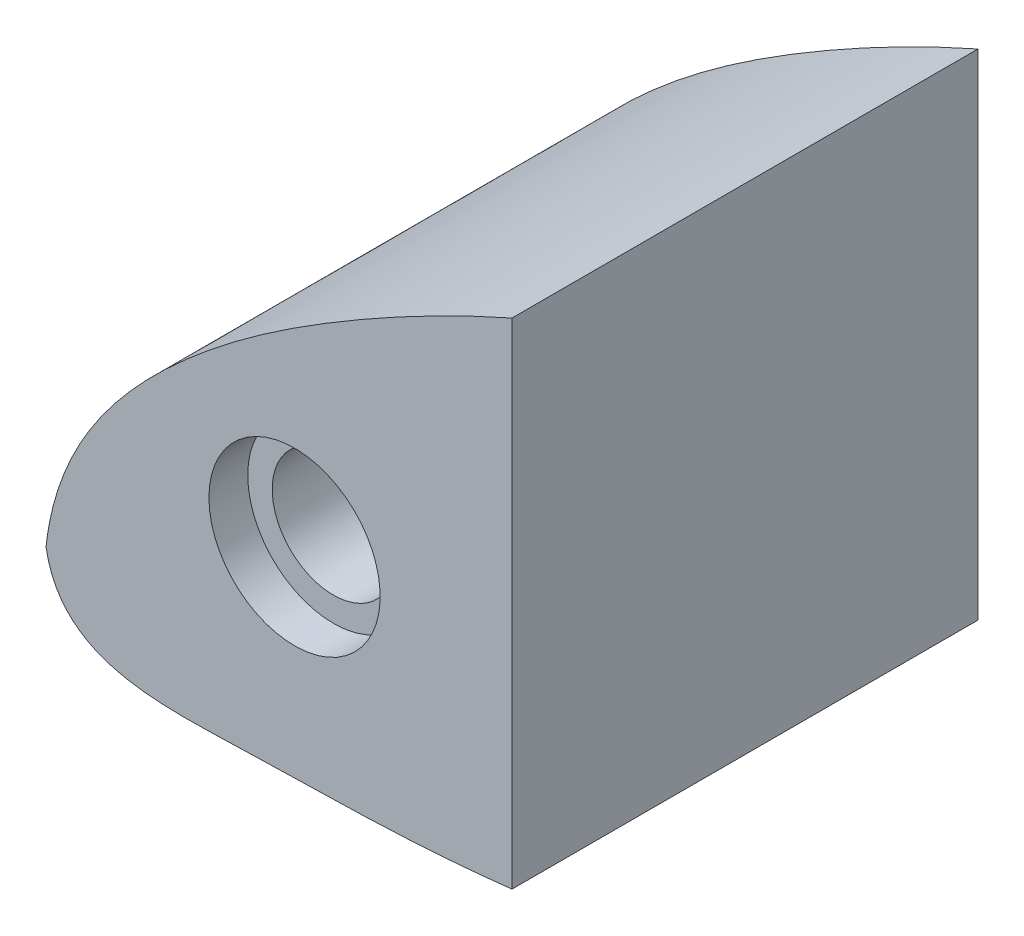
ISO-10303-21;
HEADER;
FILE_DESCRIPTION(('STEP AP214'),'2;1');
FILE_NAME('part.step','',(''),(''),'','','');
FILE_SCHEMA(('AUTOMOTIVE_DESIGN { 1 0 10303 214 1 1 1 1 }'));
ENDSEC;
DATA;
#1=APPLICATION_CONTEXT('core data for automotive mechanical design processes');
#2=APPLICATION_PROTOCOL_DEFINITION('international standard','automotive_design',2000,#1);
#3=PRODUCT_CONTEXT('',#1,'mechanical');
#4=PRODUCT('Part','Part','',(#3));
#5=PRODUCT_RELATED_PRODUCT_CATEGORY('part','',(#4));
#6=PRODUCT_DEFINITION_FORMATION('','',#4);
#7=PRODUCT_DEFINITION_CONTEXT('part definition',#1,'design');
#8=PRODUCT_DEFINITION('design','',#6,#7);
#9=PRODUCT_DEFINITION_SHAPE('','',#8);
#10=(LENGTH_UNIT() NAMED_UNIT(*) SI_UNIT(.MILLI.,.METRE.));
#11=(NAMED_UNIT(*) PLANE_ANGLE_UNIT() SI_UNIT($,.RADIAN.));
#12=(NAMED_UNIT(*) SI_UNIT($,.STERADIAN.) SOLID_ANGLE_UNIT());
#13=UNCERTAINTY_MEASURE_WITH_UNIT(LENGTH_MEASURE(1.E-05),#10,'distance_accuracy_value','');
#14=(GEOMETRIC_REPRESENTATION_CONTEXT(3) GLOBAL_UNCERTAINTY_ASSIGNED_CONTEXT((#13)) GLOBAL_UNIT_ASSIGNED_CONTEXT((#10,
#11,#12)) REPRESENTATION_CONTEXT('',''));
#15=CARTESIAN_POINT('',(0.,0.,0.));
#16=DIRECTION('',(0.,0.,1.));
#17=DIRECTION('',(1.,0.,0.));
#18=AXIS2_PLACEMENT_3D('',#15,#16,#17);
#19=CARTESIAN_POINT('',(20.32,10.16,38.1));
#20=DIRECTION('',(0.,0.,-1.));
#21=DIRECTION('',(-1.,0.,0.));
#22=AXIS2_PLACEMENT_3D('',#19,#20,#21);
#23=CYLINDRICAL_SURFACE('',#22,5.);
#24=CARTESIAN_POINT('',(20.32,10.16,-38.1));
#25=DIRECTION('',(0.,0.,1.));
#26=DIRECTION('',(1.,0.,0.));
#27=AXIS2_PLACEMENT_3D('',#24,#25,#26);
#28=CIRCLE('',#27,5.);
#29=CARTESIAN_POINT('',(25.32,10.16,-38.1));
#30=VERTEX_POINT('',#29);
#31=EDGE_CURVE('E152',#30,#30,#28,.T.);
#32=ORIENTED_EDGE('',*,*,#31,.F.);
#33=EDGE_LOOP('',(#32));
#34=FACE_BOUND('',#33,.T.);
#35=CARTESIAN_POINT('',(20.32,10.16,-3.175));
#36=DIRECTION('',(0.,0.,1.));
#37=DIRECTION('',(1.,0.,0.));
#38=AXIS2_PLACEMENT_3D('',#35,#36,#37);
#39=CIRCLE('',#38,5.);
#40=CARTESIAN_POINT('',(25.32,10.16,-3.175));
#41=VERTEX_POINT('',#40);
#42=EDGE_CURVE('E147',#41,#41,#39,.T.);
#43=ORIENTED_EDGE('',*,*,#42,.T.);
#44=EDGE_LOOP('',(#43));
#45=FACE_BOUND('',#44,.T.);
#46=ADVANCED_FACE('F39',(#34,#45),#23,.F.);
#47=CARTESIAN_POINT('',(0.000560351162113587,0.000130087070423624,38.1));
#48=CARTESIAN_POINT('',(1.23071418869678,-6.92407609127206,38.1));
#49=CARTESIAN_POINT('',(15.3166033306834,-6.18906584099094,38.1));
#50=CARTESIAN_POINT('',(36.4546728163185,-6.09849990105009,38.1));
#51=CARTESIAN_POINT('',(66.5061971849192,-0.586669106973501,38.1));
#52=CARTESIAN_POINT('',(110.497331171581,6.18149522271792,38.1));
#53=CARTESIAN_POINT('',(157.718638091679,9.03065014873911,38.1));
#54=CARTESIAN_POINT('',(205.10142463584,8.83808028186313,38.1));
#55=CARTESIAN_POINT('',(235.858814759408,7.87030619247826,38.1));
#56=CARTESIAN_POINT('',(260.846344817159,5.42741339404395,38.1));
#57=CARTESIAN_POINT('',(276.264022989737,4.51435670375389,38.1));
#58=CARTESIAN_POINT('',(293.989507544058,2.09398731346533,38.1));
#59=CARTESIAN_POINT('',(303.956832564589,1.47095520994628,38.1));
#60=CARTESIAN_POINT('',(309.846313894505,0.000130087070423666,38.1));
#61=B_SPLINE_CURVE_WITH_KNOTS('',3,(#47,#48,#49,#50,#51,#52,#53,#54,#55,#56,#57,#58,#59,#60),
.UNSPECIFIED.,.F.,.F.,(4,1,1,1,1,1,1,1,1,1,1,4),(0.,0.0569078595717698,0.106482711504673,
0.214488052979465,0.341297688349143,0.535095665520157,0.664680853556909,0.794660698192775,
0.828978881532905,0.904725108725214,0.942212919019968,1.),.UNSPECIFIED.);
#62=DIRECTION('',(0.,0.,-1.));
#63=VECTOR('',#62,1.);
#64=SURFACE_OF_LINEAR_EXTRUSION('',#61,#63);
#65=DIRECTION('',(0.,0.,-1.));
#66=VECTOR('',#65,1.);
#67=CARTESIAN_POINT('',(38.1,-5.18097252404465,38.1));
#68=LINE('',#67,#66);
#69=CARTESIAN_POINT('',(38.0999999979874,-5.18097252426853,-38.1));
#70=VERTEX_POINT('',#69);
#71=CARTESIAN_POINT('',(38.1,-5.18097252404465,0.));
#72=VERTEX_POINT('',#71);
#73=EDGE_CURVE('E50',#70,#72,#68,.F.);
#74=ORIENTED_EDGE('',*,*,#73,.T.);
#75=CARTESIAN_POINT('',(0.000560351162113587,0.000130087070423624,0.));
#76=CARTESIAN_POINT('',(1.23071418869678,-6.92407609127206,0.));
#77=CARTESIAN_POINT('',(15.3166033306834,-6.18906584099094,0.));
#78=CARTESIAN_POINT('',(36.4546728163185,-6.09849990105009,0.));
#79=CARTESIAN_POINT('',(66.5061971849192,-0.586669106973501,0.));
#80=CARTESIAN_POINT('',(110.497331171581,6.18149522271792,0.));
#81=CARTESIAN_POINT('',(157.718638091679,9.03065014873911,0.));
#82=CARTESIAN_POINT('',(205.10142463584,8.83808028186313,0.));
#83=CARTESIAN_POINT('',(235.858814759408,7.87030619247826,0.));
#84=CARTESIAN_POINT('',(260.846344817159,5.42741339404395,0.));
#85=CARTESIAN_POINT('',(276.264022989737,4.51435670375389,0.));
#86=CARTESIAN_POINT('',(293.989507544058,2.09398731346533,0.));
#87=CARTESIAN_POINT('',(303.956832564589,1.47095520994628,0.));
#88=CARTESIAN_POINT('',(309.846313894505,0.000130087070423666,0.));
#89=B_SPLINE_CURVE_WITH_KNOTS('',3,(#75,#76,#77,#78,#79,#80,#81,#82,#83,#84,#85,#86,#87,#88),
.UNSPECIFIED.,.F.,.F.,(4,1,1,1,1,1,1,1,1,1,1,4),(0.,0.0569078595717698,0.106482711504673,
0.214488052979465,0.341297688349143,0.535095665520157,0.664680853556909,0.794660698192775,
0.828978881532905,0.904725108725214,0.942212919019968,1.),.UNSPECIFIED.);
#90=CARTESIAN_POINT('',(0.000560351162114684,0.000130087070421281,0.));
#91=VERTEX_POINT('',#90);
#92=EDGE_CURVE('E58',#72,#91,#89,.F.);
#93=ORIENTED_EDGE('',*,*,#92,.T.);
#94=DIRECTION('',(0.,0.,-1.));
#95=VECTOR('',#94,1.);
#96=CARTESIAN_POINT('',(0.000560351162116727,0.000130087070423829,38.1));
#97=LINE('',#96,#95);
#98=CARTESIAN_POINT('',(0.000560351162116727,0.000130087070423829,-38.1));
#99=VERTEX_POINT('',#98);
#100=EDGE_CURVE('E11',#91,#99,#97,.T.);
#101=ORIENTED_EDGE('',*,*,#100,.T.);
#102=CARTESIAN_POINT('',(0.000560351162113587,0.000130087070423624,-38.1));
#103=CARTESIAN_POINT('',(1.23071418869678,-6.92407609127206,-38.1));
#104=CARTESIAN_POINT('',(15.3166033306834,-6.18906584099094,-38.1));
#105=CARTESIAN_POINT('',(36.4546728163185,-6.09849990105009,-38.1));
#106=CARTESIAN_POINT('',(66.5061971849192,-0.586669106973501,-38.1));
#107=CARTESIAN_POINT('',(110.497331171581,6.18149522271792,-38.1));
#108=CARTESIAN_POINT('',(157.718638091679,9.03065014873911,-38.1));
#109=CARTESIAN_POINT('',(205.10142463584,8.83808028186313,-38.1));
#110=CARTESIAN_POINT('',(235.858814759408,7.87030619247826,-38.1));
#111=CARTESIAN_POINT('',(260.846344817159,5.42741339404395,-38.1));
#112=CARTESIAN_POINT('',(276.264022989737,4.51435670375389,-38.1));
#113=CARTESIAN_POINT('',(293.989507544058,2.09398731346533,-38.1));
#114=CARTESIAN_POINT('',(303.956832564589,1.47095520994628,-38.1));
#115=CARTESIAN_POINT('',(309.846313894505,0.000130087070423666,-38.1));
#116=B_SPLINE_CURVE_WITH_KNOTS('',3,(#102,#103,#104,#105,#106,#107,#108,#109,#110,#111,#112,
#113,#114,#115),.UNSPECIFIED.,.F.,.F.,(4,1,1,1,1,1,1,1,1,1,1,4),(0.,0.0569078595717698,
0.106482711504673,0.214488052979465,0.341297688349143,0.535095665520157,0.664680853556909,
0.794660698192775,0.828978881532905,0.904725108725214,0.942212919019968,1.),.UNSPECIFIED.);
#117=EDGE_CURVE('E97',#99,#70,#116,.T.);
#118=ORIENTED_EDGE('',*,*,#117,.T.);
#119=EDGE_LOOP('',(#74,#93,#101,#118));
#120=FACE_BOUND('',#119,.T.);
#121=ADVANCED_FACE('F41',(#120),#64,.F.);
#122=CARTESIAN_POINT('',(309.846313894505,0.000130087070423864,38.1));
#123=CARTESIAN_POINT('',(314.816918223261,-0.51620674157964,38.1));
#124=CARTESIAN_POINT('',(301.273197720551,4.38282813873556,38.1));
#125=CARTESIAN_POINT('',(290.359837670022,8.71099439045776,38.1));
#126=CARTESIAN_POINT('',(256.952064400645,19.5289209482833,38.1));
#127=CARTESIAN_POINT('',(217.961060472083,29.6129748944238,38.1));
#128=CARTESIAN_POINT('',(173.256699242147,40.0411042779434,38.1));
#129=CARTESIAN_POINT('',(131.400792108858,47.8848319151037,38.1));
#130=CARTESIAN_POINT('',(89.5976184754884,49.290763053775,38.1));
#131=CARTESIAN_POINT('',(52.1111282710831,42.0692152748914,38.1));
#132=CARTESIAN_POINT('',(26.2867198183782,29.9751763284633,38.1));
#133=CARTESIAN_POINT('',(8.64909202481883,17.8566051741579,38.1));
#134=CARTESIAN_POINT('',(0.810633126632263,7.35919605469637,38.1));
#135=CARTESIAN_POINT('',(0.000560351162116727,0.000130087070423829,38.1));
#136=B_SPLINE_CURVE_WITH_KNOTS('',3,(#122,#123,#124,#125,#126,#127,#128,#129,#130,#131,#132,
#133,#134,#135),.UNSPECIFIED.,.F.,.F.,(4,1,1,1,1,1,1,1,1,1,1,4),(0.,0.0239417713693992,
0.070244030177139,0.147561721425381,0.308455887006792,0.442387865106874,0.551517565626309,
0.687091076796298,0.811391258419108,0.886311735305172,0.939136382225768,1.),.UNSPECIFIED.);
#137=DIRECTION('',(0.,0.,-1.));
#138=VECTOR('',#137,1.);
#139=SURFACE_OF_LINEAR_EXTRUSION('',#136,#138);
#140=ORIENTED_EDGE('',*,*,#100,.F.);
#141=CARTESIAN_POINT('',(309.846313894505,0.000130087070423864,0.));
#142=CARTESIAN_POINT('',(314.816918223261,-0.51620674157964,0.));
#143=CARTESIAN_POINT('',(301.273197720551,4.38282813873556,0.));
#144=CARTESIAN_POINT('',(290.359837670022,8.71099439045776,0.));
#145=CARTESIAN_POINT('',(256.952064400645,19.5289209482833,0.));
#146=CARTESIAN_POINT('',(217.961060472083,29.6129748944238,0.));
#147=CARTESIAN_POINT('',(173.256699242147,40.0411042779434,0.));
#148=CARTESIAN_POINT('',(131.400792108858,47.8848319151037,0.));
#149=CARTESIAN_POINT('',(89.5976184754884,49.290763053775,0.));
#150=CARTESIAN_POINT('',(52.1111282710831,42.0692152748914,0.));
#151=CARTESIAN_POINT('',(26.2867198183782,29.9751763284633,0.));
#152=CARTESIAN_POINT('',(8.64909202481883,17.8566051741579,0.));
#153=CARTESIAN_POINT('',(0.810633126632263,7.35919605469637,0.));
#154=CARTESIAN_POINT('',(0.000560351162116727,0.000130087070423829,0.));
#155=B_SPLINE_CURVE_WITH_KNOTS('',3,(#141,#142,#143,#144,#145,#146,#147,#148,#149,#150,#151,
#152,#153,#154),.UNSPECIFIED.,.F.,.F.,(4,1,1,1,1,1,1,1,1,1,1,4),(0.,0.0239417713693992,
0.070244030177139,0.147561721425381,0.308455887006792,0.442387865106874,0.551517565626309,
0.687091076796298,0.811391258419108,0.886311735305172,0.939136382225768,1.),.UNSPECIFIED.);
#156=CARTESIAN_POINT('',(38.1,35.2581330206231,0.));
#157=VERTEX_POINT('',#156);
#158=EDGE_CURVE('E77',#91,#157,#155,.F.);
#159=ORIENTED_EDGE('',*,*,#158,.T.);
#160=DIRECTION('',(0.,0.,-1.));
#161=VECTOR('',#160,1.);
#162=CARTESIAN_POINT('',(38.1,35.2581330224171,38.1));
#163=LINE('',#162,#161);
#164=CARTESIAN_POINT('',(38.1,35.2581330206231,-38.1));
#165=VERTEX_POINT('',#164);
#166=EDGE_CURVE('E85',#157,#165,#163,.T.);
#167=ORIENTED_EDGE('',*,*,#166,.T.);
#168=CARTESIAN_POINT('',(309.846313894505,0.000130087070423864,-38.1));
#169=CARTESIAN_POINT('',(314.816918223261,-0.51620674157964,-38.1));
#170=CARTESIAN_POINT('',(301.273197720551,4.38282813873556,-38.1));
#171=CARTESIAN_POINT('',(290.359837670022,8.71099439045776,-38.1));
#172=CARTESIAN_POINT('',(256.952064400645,19.5289209482833,-38.1));
#173=CARTESIAN_POINT('',(217.961060472083,29.6129748944238,-38.1));
#174=CARTESIAN_POINT('',(173.256699242147,40.0411042779434,-38.1));
#175=CARTESIAN_POINT('',(131.400792108858,47.8848319151037,-38.1));
#176=CARTESIAN_POINT('',(89.5976184754884,49.290763053775,-38.1));
#177=CARTESIAN_POINT('',(52.1111282710831,42.0692152748914,-38.1));
#178=CARTESIAN_POINT('',(26.2867198183782,29.9751763284633,-38.1));
#179=CARTESIAN_POINT('',(8.64909202481883,17.8566051741579,-38.1));
#180=CARTESIAN_POINT('',(0.810633126632263,7.35919605469637,-38.1));
#181=CARTESIAN_POINT('',(0.000560351162116727,0.000130087070423829,-38.1));
#182=B_SPLINE_CURVE_WITH_KNOTS('',3,(#168,#169,#170,#171,#172,#173,#174,#175,#176,#177,#178,
#179,#180,#181),.UNSPECIFIED.,.F.,.F.,(4,1,1,1,1,1,1,1,1,1,1,4),(0.,0.0239417713693992,
0.070244030177139,0.147561721425381,0.308455887006792,0.442387865106874,0.551517565626309,
0.687091076796298,0.811391258419108,0.886311735305172,0.939136382225768,1.),.UNSPECIFIED.);
#183=EDGE_CURVE('E92',#165,#99,#182,.T.);
#184=ORIENTED_EDGE('',*,*,#183,.T.);
#185=EDGE_LOOP('',(#140,#159,#167,#184));
#186=FACE_BOUND('',#185,.T.);
#187=ADVANCED_FACE('F83',(#186),#139,.F.);
#188=CARTESIAN_POINT('',(153.387816973495,8.33338198857885,-38.1));
#189=DIRECTION('',(0.,0.,1.));
#190=DIRECTION('',(-1.,0.,0.));
#191=AXIS2_PLACEMENT_3D('',#188,#189,#190);
#192=PLANE('',#191);
#193=ORIENTED_EDGE('',*,*,#31,.T.);
#194=EDGE_LOOP('',(#193));
#195=FACE_BOUND('',#194,.T.);
#196=DIRECTION('',(0.,-1.,0.));
#197=VECTOR('',#196,1.);
#198=CARTESIAN_POINT('',(38.1,71.7179988353335,-38.1));
#199=LINE('',#198,#197);
#200=EDGE_CURVE('E89',#165,#70,#199,.T.);
#201=ORIENTED_EDGE('',*,*,#200,.T.);
#202=ORIENTED_EDGE('',*,*,#117,.F.);
#203=ORIENTED_EDGE('',*,*,#183,.F.);
#204=EDGE_LOOP('',(#201,#202,#203));
#205=FACE_BOUND('',#204,.T.);
#206=ADVANCED_FACE('F117',(#195,#205),#192,.F.);
#207=CARTESIAN_POINT('',(38.1,71.7179988353335,0.));
#208=DIRECTION('',(-1.,0.,0.));
#209=DIRECTION('',(0.,-1.,0.));
#210=AXIS2_PLACEMENT_3D('',#207,#208,#209);
#211=PLANE('',#210);
#212=ORIENTED_EDGE('',*,*,#166,.F.);
#213=DIRECTION('',(0.,1.,0.));
#214=VECTOR('',#213,1.);
#215=CARTESIAN_POINT('',(38.1,35.2581330206231,0.));
#216=LINE('',#215,#214);
#217=EDGE_CURVE('E74',#72,#157,#216,.T.);
#218=ORIENTED_EDGE('',*,*,#217,.F.);
#219=ORIENTED_EDGE('',*,*,#73,.F.);
#220=ORIENTED_EDGE('',*,*,#200,.F.);
#221=EDGE_LOOP('',(#212,#218,#219,#220));
#222=FACE_BOUND('',#221,.T.);
#223=ADVANCED_FACE('F88',(#222),#211,.F.);
#224=CARTESIAN_POINT('',(20.32,10.16,3.175));
#225=DIRECTION('',(0.,0.,-1.));
#226=DIRECTION('',(-1.,0.,0.));
#227=AXIS2_PLACEMENT_3D('',#224,#225,#226);
#228=CYLINDRICAL_SURFACE('',#227,7.);
#229=CARTESIAN_POINT('',(20.32,10.16,0.));
#230=DIRECTION('',(0.,0.,-1.));
#231=DIRECTION('',(-1.,0.,0.));
#232=AXIS2_PLACEMENT_3D('',#229,#230,#231);
#233=CIRCLE('',#232,7.);
#234=CARTESIAN_POINT('',(13.32,10.16,0.));
#235=VERTEX_POINT('',#234);
#236=EDGE_CURVE('E44',#235,#235,#233,.F.);
#237=ORIENTED_EDGE('',*,*,#236,.T.);
#238=EDGE_LOOP('',(#237));
#239=FACE_BOUND('',#238,.T.);
#240=CARTESIAN_POINT('',(20.32,10.16,-3.175));
#241=DIRECTION('',(0.,0.,-1.));
#242=DIRECTION('',(-1.,0.,0.));
#243=AXIS2_PLACEMENT_3D('',#240,#241,#242);
#244=CIRCLE('',#243,7.);
#245=CARTESIAN_POINT('',(13.32,10.16,-3.175));
#246=VERTEX_POINT('',#245);
#247=EDGE_CURVE('E143',#246,#246,#244,.T.);
#248=ORIENTED_EDGE('',*,*,#247,.T.);
#249=EDGE_LOOP('',(#248));
#250=FACE_BOUND('',#249,.T.);
#251=ADVANCED_FACE('F120',(#239,#250),#228,.F.);
#252=CARTESIAN_POINT('',(20.32,10.16,-3.175));
#253=DIRECTION('',(0.,0.,1.));
#254=DIRECTION('',(-1.,0.,0.));
#255=AXIS2_PLACEMENT_3D('',#252,#253,#254);
#256=PLANE('',#255);
#257=ORIENTED_EDGE('',*,*,#42,.F.);
#258=EDGE_LOOP('',(#257));
#259=FACE_BOUND('',#258,.T.);
#260=ORIENTED_EDGE('',*,*,#247,.F.);
#261=EDGE_LOOP('',(#260));
#262=FACE_BOUND('',#261,.T.);
#263=ADVANCED_FACE('F123',(#259,#262),#256,.T.);
#264=CARTESIAN_POINT('',(0.000560351162109951,35.2581330206231,0.));
#265=DIRECTION('',(0.,0.,-1.));
#266=DIRECTION('',(-1.,0.,0.));
#267=AXIS2_PLACEMENT_3D('',#264,#265,#266);
#268=PLANE('',#267);
#269=ORIENTED_EDGE('',*,*,#236,.F.);
#270=EDGE_LOOP('',(#269));
#271=FACE_BOUND('',#270,.T.);
#272=ORIENTED_EDGE('',*,*,#217,.T.);
#273=ORIENTED_EDGE('',*,*,#158,.F.);
#274=ORIENTED_EDGE('',*,*,#92,.F.);
#275=EDGE_LOOP('',(#272,#273,#274));
#276=FACE_BOUND('',#275,.T.);
#277=ADVANCED_FACE('F76',(#271,#276),#268,.F.);
#278=CLOSED_SHELL('',(#46,#121,#187,#206,#223,#251,#263,#277));
#279=MANIFOLD_SOLID_BREP('B2',#278);
#280=ADVANCED_BREP_SHAPE_REPRESENTATION('',(#18,#279),#14);
#281=SHAPE_DEFINITION_REPRESENTATION(#9,#280);
ENDSEC;
END-ISO-10303-21;
